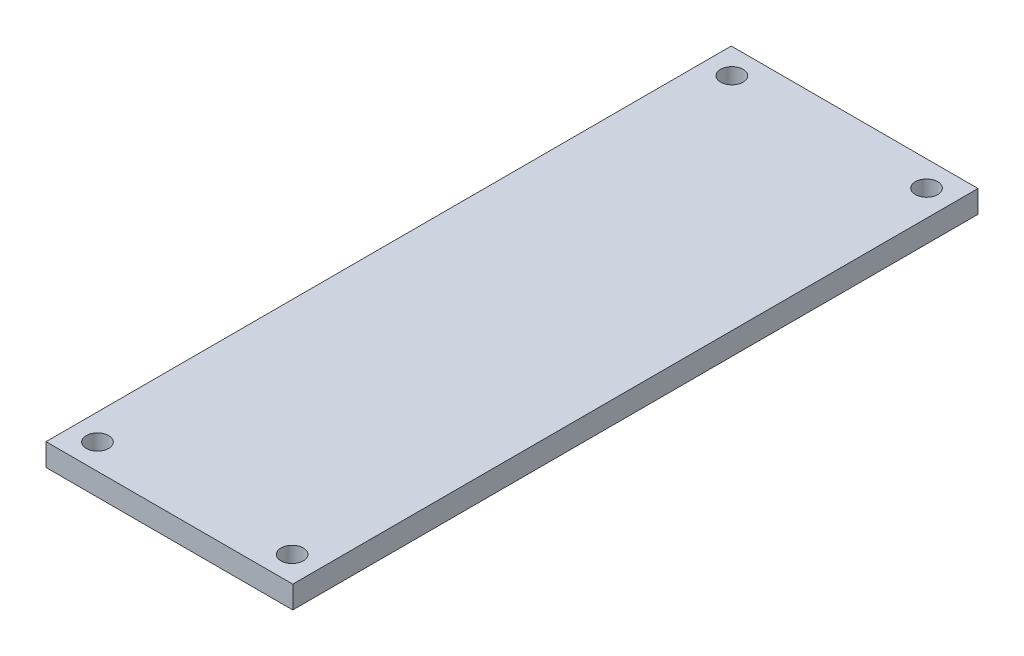
ISO-10303-21;
HEADER;
FILE_DESCRIPTION(('STEP AP214'),'2;1');
FILE_NAME('part.step','',(''),(''),'','','');
FILE_SCHEMA(('AUTOMOTIVE_DESIGN { 1 0 10303 214 1 1 1 1 }'));
ENDSEC;
DATA;
#1=APPLICATION_CONTEXT('core data for automotive mechanical design processes');
#2=APPLICATION_PROTOCOL_DEFINITION('international standard','automotive_design',2000,#1);
#3=PRODUCT_CONTEXT('',#1,'mechanical');
#4=PRODUCT('Part','Part','',(#3));
#5=PRODUCT_RELATED_PRODUCT_CATEGORY('part','',(#4));
#6=PRODUCT_DEFINITION_FORMATION('','',#4);
#7=PRODUCT_DEFINITION_CONTEXT('part definition',#1,'design');
#8=PRODUCT_DEFINITION('design','',#6,#7);
#9=PRODUCT_DEFINITION_SHAPE('','',#8);
#10=(LENGTH_UNIT() NAMED_UNIT(*) SI_UNIT(.MILLI.,.METRE.));
#11=(NAMED_UNIT(*) PLANE_ANGLE_UNIT() SI_UNIT($,.RADIAN.));
#12=(NAMED_UNIT(*) SI_UNIT($,.STERADIAN.) SOLID_ANGLE_UNIT());
#13=UNCERTAINTY_MEASURE_WITH_UNIT(LENGTH_MEASURE(1.E-05),#10,'distance_accuracy_value','');
#14=(GEOMETRIC_REPRESENTATION_CONTEXT(3) GLOBAL_UNCERTAINTY_ASSIGNED_CONTEXT((#13)) GLOBAL_UNIT_ASSIGNED_CONTEXT((#10,
#11,#12)) REPRESENTATION_CONTEXT('',''));
#15=CARTESIAN_POINT('',(0.,0.,0.));
#16=DIRECTION('',(0.,0.,1.));
#17=DIRECTION('',(1.,0.,0.));
#18=AXIS2_PLACEMENT_3D('',#15,#16,#17);
#19=CARTESIAN_POINT('',(16.525,3.,-45.89));
#20=DIRECTION('',(-1.,0.,0.));
#21=DIRECTION('',(0.,0.,1.));
#22=AXIS2_PLACEMENT_3D('',#19,#20,#21);
#23=PLANE('',#22);
#24=DIRECTION('',(0.,0.,-1.));
#25=VECTOR('',#24,1.);
#26=CARTESIAN_POINT('',(16.525,0.,-45.89));
#27=LINE('',#26,#25);
#28=CARTESIAN_POINT('',(16.525,0.,45.89));
#29=VERTEX_POINT('',#28);
#30=CARTESIAN_POINT('',(16.525,0.,-45.89));
#31=VERTEX_POINT('',#30);
#32=EDGE_CURVE('E101',#29,#31,#27,.T.);
#33=ORIENTED_EDGE('',*,*,#32,.T.);
#34=DIRECTION('',(0.,-1.,0.));
#35=VECTOR('',#34,1.);
#36=CARTESIAN_POINT('',(16.525,3.,-45.89));
#37=LINE('',#36,#35);
#38=CARTESIAN_POINT('',(16.525,3.,-45.89));
#39=VERTEX_POINT('',#38);
#40=EDGE_CURVE('E11',#39,#31,#37,.T.);
#41=ORIENTED_EDGE('',*,*,#40,.F.);
#42=DIRECTION('',(0.,0.,-1.));
#43=VECTOR('',#42,1.);
#44=CARTESIAN_POINT('',(16.525,3.,-45.89));
#45=LINE('',#44,#43);
#46=CARTESIAN_POINT('',(16.525,3.,45.89));
#47=VERTEX_POINT('',#46);
#48=EDGE_CURVE('E88',#47,#39,#45,.T.);
#49=ORIENTED_EDGE('',*,*,#48,.F.);
#50=DIRECTION('',(0.,-1.,0.));
#51=VECTOR('',#50,1.);
#52=CARTESIAN_POINT('',(16.525,3.,45.89));
#53=LINE('',#52,#51);
#54=EDGE_CURVE('E97',#47,#29,#53,.T.);
#55=ORIENTED_EDGE('',*,*,#54,.T.);
#56=EDGE_LOOP('',(#33,#41,#49,#55));
#57=FACE_BOUND('',#56,.T.);
#58=ADVANCED_FACE('F35',(#57),#23,.F.);
#59=CARTESIAN_POINT('',(-16.525,3.,-45.89));
#60=DIRECTION('',(0.,0.,1.));
#61=DIRECTION('',(1.,0.,0.));
#62=AXIS2_PLACEMENT_3D('',#59,#60,#61);
#63=PLANE('',#62);
#64=DIRECTION('',(-1.,0.,0.));
#65=VECTOR('',#64,1.);
#66=CARTESIAN_POINT('',(-16.525,0.,-45.89));
#67=LINE('',#66,#65);
#68=CARTESIAN_POINT('',(-16.525,0.,-45.89));
#69=VERTEX_POINT('',#68);
#70=EDGE_CURVE('E92',#31,#69,#67,.T.);
#71=ORIENTED_EDGE('',*,*,#70,.T.);
#72=DIRECTION('',(0.,-1.,0.));
#73=VECTOR('',#72,1.);
#74=CARTESIAN_POINT('',(-16.525,3.,-45.89));
#75=LINE('',#74,#73);
#76=CARTESIAN_POINT('',(-16.525,3.,-45.89));
#77=VERTEX_POINT('',#76);
#78=EDGE_CURVE('E44',#77,#69,#75,.T.);
#79=ORIENTED_EDGE('',*,*,#78,.F.);
#80=DIRECTION('',(-1.,0.,0.));
#81=VECTOR('',#80,1.);
#82=CARTESIAN_POINT('',(-16.525,3.,-45.89));
#83=LINE('',#82,#81);
#84=EDGE_CURVE('E83',#39,#77,#83,.T.);
#85=ORIENTED_EDGE('',*,*,#84,.F.);
#86=ORIENTED_EDGE('',*,*,#40,.T.);
#87=EDGE_LOOP('',(#71,#79,#85,#86));
#88=FACE_BOUND('',#87,.T.);
#89=ADVANCED_FACE('F91',(#88),#63,.F.);
#90=CARTESIAN_POINT('',(-16.525,3.,-45.89));
#91=DIRECTION('',(1.,0.,0.));
#92=DIRECTION('',(0.,0.,-1.));
#93=AXIS2_PLACEMENT_3D('',#90,#91,#92);
#94=PLANE('',#93);
#95=DIRECTION('',(0.,0.,1.));
#96=VECTOR('',#95,1.);
#97=CARTESIAN_POINT('',(-16.525,0.,-45.89));
#98=LINE('',#97,#96);
#99=CARTESIAN_POINT('',(-16.525,0.,45.89));
#100=VERTEX_POINT('',#99);
#101=EDGE_CURVE('E70',#69,#100,#98,.T.);
#102=ORIENTED_EDGE('',*,*,#101,.T.);
#103=DIRECTION('',(0.,-1.,0.));
#104=VECTOR('',#103,1.);
#105=CARTESIAN_POINT('',(-16.525,3.,45.89));
#106=LINE('',#105,#104);
#107=CARTESIAN_POINT('',(-16.525,3.,45.89));
#108=VERTEX_POINT('',#107);
#109=EDGE_CURVE('E93',#108,#100,#106,.T.);
#110=ORIENTED_EDGE('',*,*,#109,.F.);
#111=DIRECTION('',(0.,0.,1.));
#112=VECTOR('',#111,1.);
#113=CARTESIAN_POINT('',(-16.525,3.,-45.89));
#114=LINE('',#113,#112);
#115=EDGE_CURVE('E86',#77,#108,#114,.T.);
#116=ORIENTED_EDGE('',*,*,#115,.F.);
#117=ORIENTED_EDGE('',*,*,#78,.T.);
#118=EDGE_LOOP('',(#102,#110,#116,#117));
#119=FACE_BOUND('',#118,.T.);
#120=ADVANCED_FACE('F95',(#119),#94,.F.);
#121=CARTESIAN_POINT('',(-16.525,3.,45.89));
#122=DIRECTION('',(0.,0.,-1.));
#123=DIRECTION('',(-1.,0.,0.));
#124=AXIS2_PLACEMENT_3D('',#121,#122,#123);
#125=PLANE('',#124);
#126=DIRECTION('',(1.,0.,0.));
#127=VECTOR('',#126,1.);
#128=CARTESIAN_POINT('',(-16.525,0.,45.89));
#129=LINE('',#128,#127);
#130=EDGE_CURVE('E76',#100,#29,#129,.T.);
#131=ORIENTED_EDGE('',*,*,#130,.T.);
#132=ORIENTED_EDGE('',*,*,#54,.F.);
#133=DIRECTION('',(1.,0.,0.));
#134=VECTOR('',#133,1.);
#135=CARTESIAN_POINT('',(-16.525,3.,45.89));
#136=LINE('',#135,#134);
#137=EDGE_CURVE('E53',#108,#47,#136,.T.);
#138=ORIENTED_EDGE('',*,*,#137,.F.);
#139=ORIENTED_EDGE('',*,*,#109,.T.);
#140=EDGE_LOOP('',(#131,#132,#138,#139));
#141=FACE_BOUND('',#140,.T.);
#142=ADVANCED_FACE('F143',(#141),#125,.F.);
#143=CARTESIAN_POINT('',(0.,3.,0.));
#144=DIRECTION('',(0.,1.,0.));
#145=DIRECTION('',(0.,0.,1.));
#146=AXIS2_PLACEMENT_3D('',#143,#144,#145);
#147=PLANE('',#146);
#148=CARTESIAN_POINT('',(-13.0376862790982,3.,42.485614979892));
#149=DIRECTION('',(0.,1.,0.));
#150=DIRECTION('',(0.,0.,-1.));
#151=AXIS2_PLACEMENT_3D('',#148,#149,#150);
#152=CIRCLE('',#151,1.5);
#153=CARTESIAN_POINT('',(-13.0376862790982,3.,40.985614979892));
#154=VERTEX_POINT('',#153);
#155=EDGE_CURVE('E116',#154,#154,#152,.T.);
#156=ORIENTED_EDGE('',*,*,#155,.F.);
#157=EDGE_LOOP('',(#156));
#158=FACE_BOUND('',#157,.T.);
#159=CARTESIAN_POINT('',(-13.0376862790982,3.,-42.485614979892));
#160=DIRECTION('',(0.,1.,0.));
#161=DIRECTION('',(0.,0.,1.));
#162=AXIS2_PLACEMENT_3D('',#159,#160,#161);
#163=CIRCLE('',#162,1.5);
#164=CARTESIAN_POINT('',(-13.0376862790982,3.,-40.985614979892));
#165=VERTEX_POINT('',#164);
#166=EDGE_CURVE('E131',#165,#165,#163,.T.);
#167=ORIENTED_EDGE('',*,*,#166,.F.);
#168=EDGE_LOOP('',(#167));
#169=FACE_BOUND('',#168,.T.);
#170=CARTESIAN_POINT('',(13.0376862790982,3.,-42.485614979892));
#171=DIRECTION('',(0.,1.,0.));
#172=DIRECTION('',(0.,0.,-1.));
#173=AXIS2_PLACEMENT_3D('',#170,#171,#172);
#174=CIRCLE('',#173,1.5);
#175=CARTESIAN_POINT('',(13.0376862790982,3.,-43.985614979892));
#176=VERTEX_POINT('',#175);
#177=EDGE_CURVE('E128',#176,#176,#174,.T.);
#178=ORIENTED_EDGE('',*,*,#177,.F.);
#179=EDGE_LOOP('',(#178));
#180=FACE_BOUND('',#179,.T.);
#181=CARTESIAN_POINT('',(13.0376862790982,3.,42.485614979892));
#182=DIRECTION('',(0.,1.,0.));
#183=DIRECTION('',(0.,0.,1.));
#184=AXIS2_PLACEMENT_3D('',#181,#182,#183);
#185=CIRCLE('',#184,1.5);
#186=CARTESIAN_POINT('',(13.0376862790982,3.,43.985614979892));
#187=VERTEX_POINT('',#186);
#188=EDGE_CURVE('E112',#187,#187,#185,.T.);
#189=ORIENTED_EDGE('',*,*,#188,.F.);
#190=EDGE_LOOP('',(#189));
#191=FACE_BOUND('',#190,.T.);
#192=ORIENTED_EDGE('',*,*,#48,.T.);
#193=ORIENTED_EDGE('',*,*,#84,.T.);
#194=ORIENTED_EDGE('',*,*,#115,.T.);
#195=ORIENTED_EDGE('',*,*,#137,.T.);
#196=EDGE_LOOP('',(#192,#193,#194,#195));
#197=FACE_BOUND('',#196,.T.);
#198=ADVANCED_FACE('F84',(#158,#169,#180,#191,#197),#147,.T.);
#199=CARTESIAN_POINT('',(0.,0.,0.));
#200=DIRECTION('',(0.,1.,0.));
#201=DIRECTION('',(0.,0.,1.));
#202=AXIS2_PLACEMENT_3D('',#199,#200,#201);
#203=PLANE('',#202);
#204=CARTESIAN_POINT('',(-13.0376862790982,0.,42.485614979892));
#205=DIRECTION('',(0.,1.,0.));
#206=DIRECTION('',(0.,0.,1.));
#207=AXIS2_PLACEMENT_3D('',#204,#205,#206);
#208=CIRCLE('',#207,1.5);
#209=CARTESIAN_POINT('',(-13.0376862790982,0.,43.985614979892));
#210=VERTEX_POINT('',#209);
#211=EDGE_CURVE('E38',#210,#210,#208,.T.);
#212=ORIENTED_EDGE('',*,*,#211,.T.);
#213=EDGE_LOOP('',(#212));
#214=FACE_BOUND('',#213,.T.);
#215=CARTESIAN_POINT('',(-13.0376862790982,0.,-42.485614979892));
#216=DIRECTION('',(0.,1.,0.));
#217=DIRECTION('',(0.,0.,1.));
#218=AXIS2_PLACEMENT_3D('',#215,#216,#217);
#219=CIRCLE('',#218,1.5);
#220=CARTESIAN_POINT('',(-13.0376862790982,0.,-40.985614979892));
#221=VERTEX_POINT('',#220);
#222=EDGE_CURVE('E115',#221,#221,#219,.T.);
#223=ORIENTED_EDGE('',*,*,#222,.T.);
#224=EDGE_LOOP('',(#223));
#225=FACE_BOUND('',#224,.T.);
#226=CARTESIAN_POINT('',(13.0376862790982,0.,-42.485614979892));
#227=DIRECTION('',(0.,1.,0.));
#228=DIRECTION('',(0.,0.,1.));
#229=AXIS2_PLACEMENT_3D('',#226,#227,#228);
#230=CIRCLE('',#229,1.5);
#231=CARTESIAN_POINT('',(13.0376862790982,0.,-40.985614979892));
#232=VERTEX_POINT('',#231);
#233=EDGE_CURVE('E113',#232,#232,#230,.T.);
#234=ORIENTED_EDGE('',*,*,#233,.T.);
#235=EDGE_LOOP('',(#234));
#236=FACE_BOUND('',#235,.T.);
#237=CARTESIAN_POINT('',(13.0376862790982,0.,42.485614979892));
#238=DIRECTION('',(0.,1.,0.));
#239=DIRECTION('',(0.,0.,1.));
#240=AXIS2_PLACEMENT_3D('',#237,#238,#239);
#241=CIRCLE('',#240,1.5);
#242=CARTESIAN_POINT('',(13.0376862790982,0.,43.985614979892));
#243=VERTEX_POINT('',#242);
#244=EDGE_CURVE('E104',#243,#243,#241,.T.);
#245=ORIENTED_EDGE('',*,*,#244,.T.);
#246=EDGE_LOOP('',(#245));
#247=FACE_BOUND('',#246,.T.);
#248=ORIENTED_EDGE('',*,*,#32,.F.);
#249=ORIENTED_EDGE('',*,*,#130,.F.);
#250=ORIENTED_EDGE('',*,*,#101,.F.);
#251=ORIENTED_EDGE('',*,*,#70,.F.);
#252=EDGE_LOOP('',(#248,#249,#250,#251));
#253=FACE_BOUND('',#252,.T.);
#254=ADVANCED_FACE('F142',(#214,#225,#236,#247,#253),#203,.F.);
#255=CARTESIAN_POINT('',(13.0376862790982,-33.82,42.485614979892));
#256=DIRECTION('',(0.,1.,0.));
#257=DIRECTION('',(0.,0.,1.));
#258=AXIS2_PLACEMENT_3D('',#255,#256,#257);
#259=CYLINDRICAL_SURFACE('',#258,1.5);
#260=ORIENTED_EDGE('',*,*,#188,.T.);
#261=EDGE_LOOP('',(#260));
#262=FACE_BOUND('',#261,.T.);
#263=ORIENTED_EDGE('',*,*,#244,.F.);
#264=EDGE_LOOP('',(#263));
#265=FACE_BOUND('',#264,.T.);
#266=ADVANCED_FACE('F154',(#262,#265),#259,.F.);
#267=CARTESIAN_POINT('',(13.0376862790982,-33.82,-42.485614979892));
#268=DIRECTION('',(0.,1.,0.));
#269=DIRECTION('',(0.,0.,1.));
#270=AXIS2_PLACEMENT_3D('',#267,#268,#269);
#271=CYLINDRICAL_SURFACE('',#270,1.5);
#272=ORIENTED_EDGE('',*,*,#177,.T.);
#273=EDGE_LOOP('',(#272));
#274=FACE_BOUND('',#273,.T.);
#275=ORIENTED_EDGE('',*,*,#233,.F.);
#276=EDGE_LOOP('',(#275));
#277=FACE_BOUND('',#276,.T.);
#278=ADVANCED_FACE('F150',(#274,#277),#271,.F.);
#279=CARTESIAN_POINT('',(-13.0376862790982,-33.82,-42.485614979892));
#280=DIRECTION('',(0.,1.,0.));
#281=DIRECTION('',(0.,0.,1.));
#282=AXIS2_PLACEMENT_3D('',#279,#280,#281);
#283=CYLINDRICAL_SURFACE('',#282,1.5);
#284=ORIENTED_EDGE('',*,*,#166,.T.);
#285=EDGE_LOOP('',(#284));
#286=FACE_BOUND('',#285,.T.);
#287=ORIENTED_EDGE('',*,*,#222,.F.);
#288=EDGE_LOOP('',(#287));
#289=FACE_BOUND('',#288,.T.);
#290=ADVANCED_FACE('F153',(#286,#289),#283,.F.);
#291=CARTESIAN_POINT('',(-13.0376862790982,-33.82,42.485614979892));
#292=DIRECTION('',(0.,1.,0.));
#293=DIRECTION('',(0.,0.,1.));
#294=AXIS2_PLACEMENT_3D('',#291,#292,#293);
#295=CYLINDRICAL_SURFACE('',#294,1.5);
#296=ORIENTED_EDGE('',*,*,#155,.T.);
#297=EDGE_LOOP('',(#296));
#298=FACE_BOUND('',#297,.T.);
#299=ORIENTED_EDGE('',*,*,#211,.F.);
#300=EDGE_LOOP('',(#299));
#301=FACE_BOUND('',#300,.T.);
#302=ADVANCED_FACE('F137',(#298,#301),#295,.F.);
#303=CLOSED_SHELL('',(#58,#89,#120,#142,#198,#254,#266,#278,#290,#302));
#304=MANIFOLD_SOLID_BREP('B2',#303);
#305=ADVANCED_BREP_SHAPE_REPRESENTATION('',(#18,#304),#14);
#306=SHAPE_DEFINITION_REPRESENTATION(#9,#305);
ENDSEC;
END-ISO-10303-21;
